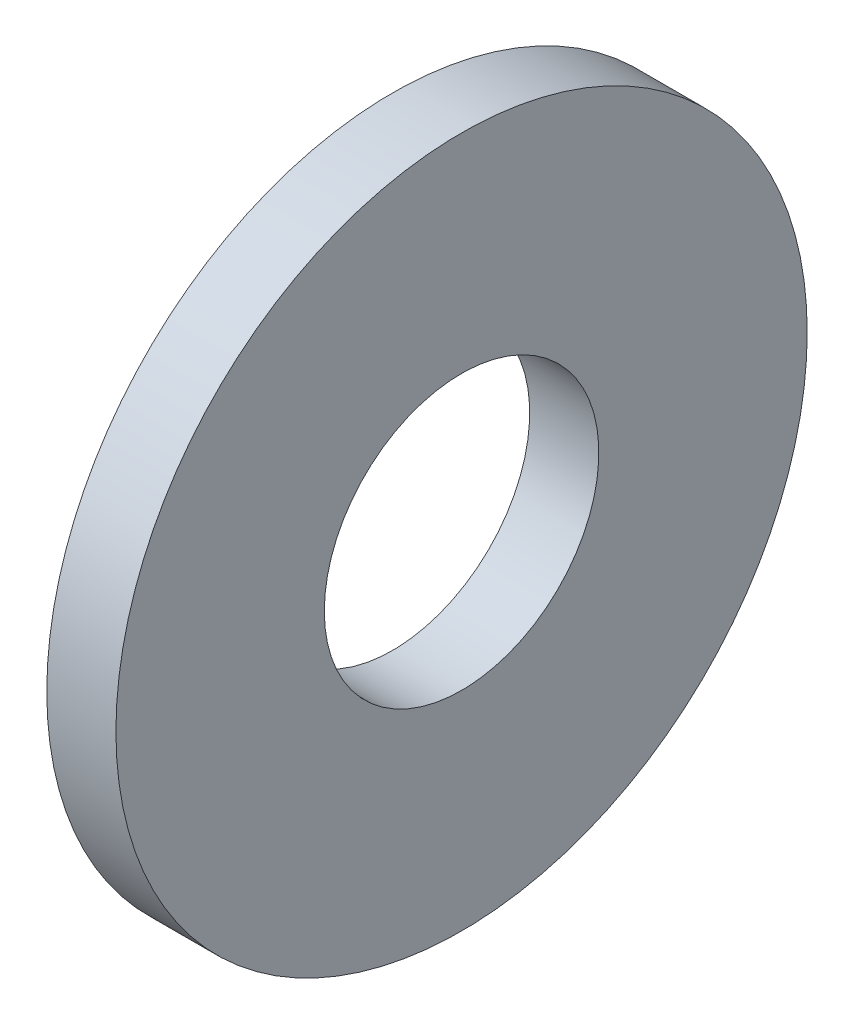
ISO-10303-21;
HEADER;
FILE_DESCRIPTION(('STEP AP214'),'2;1');
FILE_NAME('part.step','',(''),(''),'','','');
FILE_SCHEMA(('AUTOMOTIVE_DESIGN { 1 0 10303 214 1 1 1 1 }'));
ENDSEC;
DATA;
#1=APPLICATION_CONTEXT('core data for automotive mechanical design processes');
#2=APPLICATION_PROTOCOL_DEFINITION('international standard','automotive_design',2000,#1);
#3=PRODUCT_CONTEXT('',#1,'mechanical');
#4=PRODUCT('Part','Part','',(#3));
#5=PRODUCT_RELATED_PRODUCT_CATEGORY('part','',(#4));
#6=PRODUCT_DEFINITION_FORMATION('','',#4);
#7=PRODUCT_DEFINITION_CONTEXT('part definition',#1,'design');
#8=PRODUCT_DEFINITION('design','',#6,#7);
#9=PRODUCT_DEFINITION_SHAPE('','',#8);
#10=(LENGTH_UNIT() NAMED_UNIT(*) SI_UNIT(.MILLI.,.METRE.));
#11=(NAMED_UNIT(*) PLANE_ANGLE_UNIT() SI_UNIT($,.RADIAN.));
#12=(NAMED_UNIT(*) SI_UNIT($,.STERADIAN.) SOLID_ANGLE_UNIT());
#13=UNCERTAINTY_MEASURE_WITH_UNIT(LENGTH_MEASURE(1.E-05),#10,'distance_accuracy_value','');
#14=(GEOMETRIC_REPRESENTATION_CONTEXT(3) GLOBAL_UNCERTAINTY_ASSIGNED_CONTEXT((#13)) GLOBAL_UNIT_ASSIGNED_CONTEXT((#10,
#11,#12)) REPRESENTATION_CONTEXT('',''));
#15=CARTESIAN_POINT('',(0.,0.,0.));
#16=DIRECTION('',(0.,0.,1.));
#17=DIRECTION('',(1.,0.,0.));
#18=AXIS2_PLACEMENT_3D('',#15,#16,#17);
#19=CARTESIAN_POINT('',(-34.9249999999999,0.,0.));
#20=DIRECTION('',(-1.,0.,0.));
#21=DIRECTION('',(0.,0.,1.));
#22=AXIS2_PLACEMENT_3D('',#19,#20,#21);
#23=CYLINDRICAL_SURFACE('',#22,5.56);
#24=CARTESIAN_POINT('',(0.,0.,0.));
#25=DIRECTION('',(-1.,0.,0.));
#26=DIRECTION('',(0.,0.,1.));
#27=AXIS2_PLACEMENT_3D('',#24,#25,#26);
#28=CIRCLE('',#27,5.56);
#29=CARTESIAN_POINT('',(0.,0.,5.56));
#30=VERTEX_POINT('',#29);
#31=EDGE_CURVE('E10',#30,#30,#28,.T.);
#32=ORIENTED_EDGE('',*,*,#31,.F.);
#33=EDGE_LOOP('',(#32));
#34=FACE_BOUND('',#33,.T.);
#35=CARTESIAN_POINT('',(-2.8,0.,0.));
#36=DIRECTION('',(-1.,0.,0.));
#37=DIRECTION('',(0.,0.,1.));
#38=AXIS2_PLACEMENT_3D('',#35,#36,#37);
#39=CIRCLE('',#38,5.56);
#40=CARTESIAN_POINT('',(-2.8,0.,5.56));
#41=VERTEX_POINT('',#40);
#42=EDGE_CURVE('E45',#41,#41,#39,.T.);
#43=ORIENTED_EDGE('',*,*,#42,.T.);
#44=EDGE_LOOP('',(#43));
#45=FACE_BOUND('',#44,.T.);
#46=ADVANCED_FACE('F31',(#34,#45),#23,.F.);
#47=CARTESIAN_POINT('',(0.,5.56,0.));
#48=DIRECTION('',(-1.,0.,0.));
#49=DIRECTION('',(0.,0.,1.));
#50=AXIS2_PLACEMENT_3D('',#47,#48,#49);
#51=PLANE('',#50);
#52=CARTESIAN_POINT('',(0.,0.,0.));
#53=DIRECTION('',(-1.,0.,0.));
#54=DIRECTION('',(0.,0.,1.));
#55=AXIS2_PLACEMENT_3D('',#52,#53,#54);
#56=CIRCLE('',#55,14.);
#57=CARTESIAN_POINT('',(0.,0.,14.));
#58=VERTEX_POINT('',#57);
#59=EDGE_CURVE('E37',#58,#58,#56,.T.);
#60=ORIENTED_EDGE('',*,*,#59,.F.);
#61=EDGE_LOOP('',(#60));
#62=FACE_BOUND('',#61,.T.);
#63=ORIENTED_EDGE('',*,*,#31,.T.);
#64=EDGE_LOOP('',(#63));
#65=FACE_BOUND('',#64,.T.);
#66=ADVANCED_FACE('F60',(#62,#65),#51,.F.);
#67=CARTESIAN_POINT('',(-34.9249999999999,0.,0.));
#68=DIRECTION('',(-1.,0.,0.));
#69=DIRECTION('',(0.,0.,1.));
#70=AXIS2_PLACEMENT_3D('',#67,#68,#69);
#71=CYLINDRICAL_SURFACE('',#70,14.);
#72=CARTESIAN_POINT('',(-2.8,0.,0.));
#73=DIRECTION('',(-1.,0.,0.));
#74=DIRECTION('',(0.,0.,1.));
#75=AXIS2_PLACEMENT_3D('',#72,#73,#74);
#76=CIRCLE('',#75,14.);
#77=CARTESIAN_POINT('',(-2.8,0.,14.));
#78=VERTEX_POINT('',#77);
#79=EDGE_CURVE('E41',#78,#78,#76,.T.);
#80=ORIENTED_EDGE('',*,*,#79,.F.);
#81=EDGE_LOOP('',(#80));
#82=FACE_BOUND('',#81,.T.);
#83=ORIENTED_EDGE('',*,*,#59,.T.);
#84=EDGE_LOOP('',(#83));
#85=FACE_BOUND('',#84,.T.);
#86=ADVANCED_FACE('F55',(#82,#85),#71,.T.);
#87=CARTESIAN_POINT('',(-2.8,14.,0.));
#88=DIRECTION('',(1.,0.,0.));
#89=DIRECTION('',(0.,0.,-1.));
#90=AXIS2_PLACEMENT_3D('',#87,#88,#89);
#91=PLANE('',#90);
#92=ORIENTED_EDGE('',*,*,#42,.F.);
#93=EDGE_LOOP('',(#92));
#94=FACE_BOUND('',#93,.T.);
#95=ORIENTED_EDGE('',*,*,#79,.T.);
#96=EDGE_LOOP('',(#95));
#97=FACE_BOUND('',#96,.T.);
#98=ADVANCED_FACE('F52',(#94,#97),#91,.F.);
#99=CLOSED_SHELL('',(#46,#66,#86,#98));
#100=MANIFOLD_SOLID_BREP('B2',#99);
#101=ADVANCED_BREP_SHAPE_REPRESENTATION('',(#18,#100),#14);
#102=SHAPE_DEFINITION_REPRESENTATION(#9,#101);
ENDSEC;
END-ISO-10303-21;
